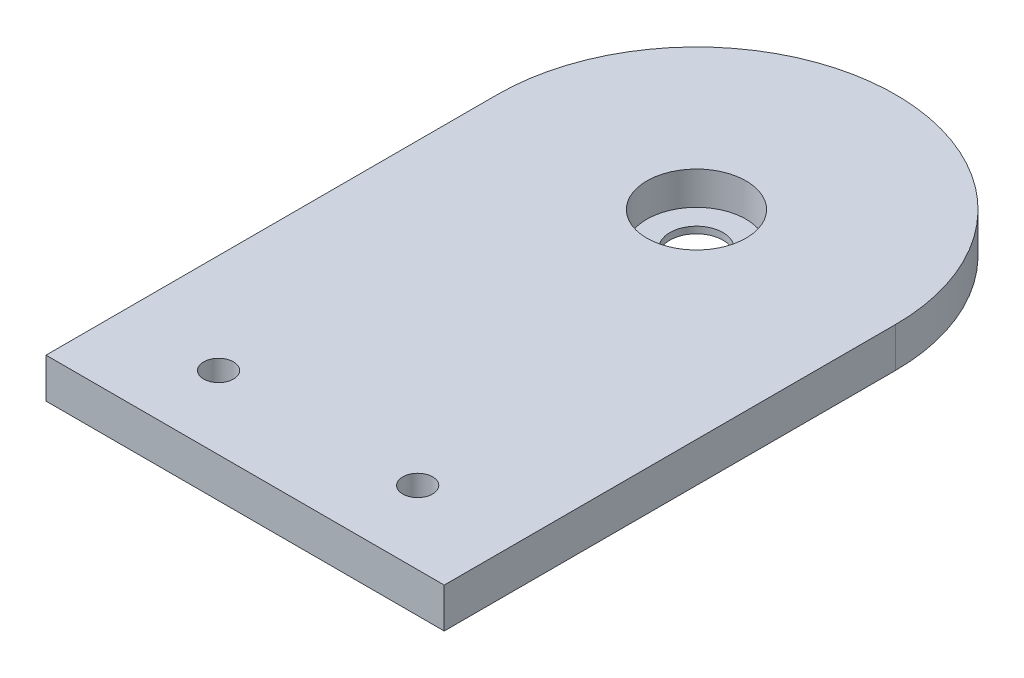
ISO-10303-21;
HEADER;
FILE_DESCRIPTION(('STEP AP214'),'2;1');
FILE_NAME('part.step','',(''),(''),'','','');
FILE_SCHEMA(('AUTOMOTIVE_DESIGN { 1 0 10303 214 1 1 1 1 }'));
ENDSEC;
DATA;
#1=APPLICATION_CONTEXT('core data for automotive mechanical design processes');
#2=APPLICATION_PROTOCOL_DEFINITION('international standard','automotive_design',2000,#1);
#3=PRODUCT_CONTEXT('',#1,'mechanical');
#4=PRODUCT('Part','Part','',(#3));
#5=PRODUCT_RELATED_PRODUCT_CATEGORY('part','',(#4));
#6=PRODUCT_DEFINITION_FORMATION('','',#4);
#7=PRODUCT_DEFINITION_CONTEXT('part definition',#1,'design');
#8=PRODUCT_DEFINITION('design','',#6,#7);
#9=PRODUCT_DEFINITION_SHAPE('','',#8);
#10=(LENGTH_UNIT() NAMED_UNIT(*) SI_UNIT(.MILLI.,.METRE.));
#11=(NAMED_UNIT(*) PLANE_ANGLE_UNIT() SI_UNIT($,.RADIAN.));
#12=(NAMED_UNIT(*) SI_UNIT($,.STERADIAN.) SOLID_ANGLE_UNIT());
#13=UNCERTAINTY_MEASURE_WITH_UNIT(LENGTH_MEASURE(1.E-05),#10,'distance_accuracy_value','');
#14=(GEOMETRIC_REPRESENTATION_CONTEXT(3) GLOBAL_UNCERTAINTY_ASSIGNED_CONTEXT((#13)) GLOBAL_UNIT_ASSIGNED_CONTEXT((#10,
#11,#12)) REPRESENTATION_CONTEXT('',''));
#15=CARTESIAN_POINT('',(0.,0.,0.));
#16=DIRECTION('',(0.,0.,1.));
#17=DIRECTION('',(1.,0.,0.));
#18=AXIS2_PLACEMENT_3D('',#15,#16,#17);
#19=CARTESIAN_POINT('',(30.,-59.75,379.));
#20=DIRECTION('',(-1.,0.,0.));
#21=DIRECTION('',(0.,0.,1.));
#22=AXIS2_PLACEMENT_3D('',#19,#20,#21);
#23=PLANE('',#22);
#24=DIRECTION('',(0.,0.,-1.));
#25=VECTOR('',#24,1.);
#26=CARTESIAN_POINT('',(30.,-65.75,379.));
#27=LINE('',#26,#25);
#28=CARTESIAN_POINT('',(30.,-65.75,398.));
#29=VERTEX_POINT('',#28);
#30=CARTESIAN_POINT('',(30.,-65.75,330.));
#31=VERTEX_POINT('',#30);
#32=EDGE_CURVE('E140',#29,#31,#27,.T.);
#33=ORIENTED_EDGE('',*,*,#32,.T.);
#34=DIRECTION('',(0.,-1.,0.));
#35=VECTOR('',#34,1.);
#36=CARTESIAN_POINT('',(30.,-59.75,330.));
#37=LINE('',#36,#35);
#38=CARTESIAN_POINT('',(30.,-59.75,330.));
#39=VERTEX_POINT('',#38);
#40=EDGE_CURVE('E11',#39,#31,#37,.T.);
#41=ORIENTED_EDGE('',*,*,#40,.F.);
#42=DIRECTION('',(0.,0.,-1.));
#43=VECTOR('',#42,1.);
#44=CARTESIAN_POINT('',(30.,-59.75,379.));
#45=LINE('',#44,#43);
#46=CARTESIAN_POINT('',(30.,-59.75,398.));
#47=VERTEX_POINT('',#46);
#48=EDGE_CURVE('E91',#47,#39,#45,.T.);
#49=ORIENTED_EDGE('',*,*,#48,.F.);
#50=DIRECTION('',(0.,-1.,0.));
#51=VECTOR('',#50,1.);
#52=CARTESIAN_POINT('',(30.,-59.75,398.));
#53=LINE('',#52,#51);
#54=EDGE_CURVE('E101',#47,#29,#53,.T.);
#55=ORIENTED_EDGE('',*,*,#54,.T.);
#56=EDGE_LOOP('',(#33,#41,#49,#55));
#57=FACE_BOUND('',#56,.T.);
#58=ADVANCED_FACE('F43',(#57),#23,.F.);
#59=CARTESIAN_POINT('',(-30.,-59.75,379.));
#60=DIRECTION('',(1.,0.,0.));
#61=DIRECTION('',(0.,0.,-1.));
#62=AXIS2_PLACEMENT_3D('',#59,#60,#61);
#63=PLANE('',#62);
#64=DIRECTION('',(0.,0.,1.));
#65=VECTOR('',#64,1.);
#66=CARTESIAN_POINT('',(-30.,-65.75,379.));
#67=LINE('',#66,#65);
#68=CARTESIAN_POINT('',(-30.,-65.75,330.));
#69=VERTEX_POINT('',#68);
#70=CARTESIAN_POINT('',(-30.,-65.75,398.));
#71=VERTEX_POINT('',#70);
#72=EDGE_CURVE('E97',#69,#71,#67,.T.);
#73=ORIENTED_EDGE('',*,*,#72,.T.);
#74=DIRECTION('',(0.,-1.,0.));
#75=VECTOR('',#74,1.);
#76=CARTESIAN_POINT('',(-30.,-59.75,398.));
#77=LINE('',#76,#75);
#78=CARTESIAN_POINT('',(-30.,-59.75,398.));
#79=VERTEX_POINT('',#78);
#80=EDGE_CURVE('E92',#79,#71,#77,.T.);
#81=ORIENTED_EDGE('',*,*,#80,.F.);
#82=DIRECTION('',(0.,0.,1.));
#83=VECTOR('',#82,1.);
#84=CARTESIAN_POINT('',(-30.,-59.75,379.));
#85=LINE('',#84,#83);
#86=CARTESIAN_POINT('',(-30.,-59.75,330.));
#87=VERTEX_POINT('',#86);
#88=EDGE_CURVE('E82',#87,#79,#85,.T.);
#89=ORIENTED_EDGE('',*,*,#88,.F.);
#90=DIRECTION('',(0.,-1.,0.));
#91=VECTOR('',#90,1.);
#92=CARTESIAN_POINT('',(-30.,-59.75,330.));
#93=LINE('',#92,#91);
#94=EDGE_CURVE('E51',#87,#69,#93,.T.);
#95=ORIENTED_EDGE('',*,*,#94,.T.);
#96=EDGE_LOOP('',(#73,#81,#89,#95));
#97=FACE_BOUND('',#96,.T.);
#98=ADVANCED_FACE('F94',(#97),#63,.F.);
#99=CARTESIAN_POINT('',(0.,-59.75,0.));
#100=DIRECTION('',(0.,-1.,0.));
#101=DIRECTION('',(0.,0.,-1.));
#102=AXIS2_PLACEMENT_3D('',#99,#100,#101);
#103=PLANE('',#102);
#104=CARTESIAN_POINT('',(-15.,-59.75,387.));
#105=DIRECTION('',(0.,1.,0.));
#106=DIRECTION('',(0.,0.,1.));
#107=AXIS2_PLACEMENT_3D('',#104,#105,#106);
#108=CIRCLE('',#107,2.25);
#109=CARTESIAN_POINT('',(-15.,-59.75,389.25));
#110=VERTEX_POINT('',#109);
#111=EDGE_CURVE('E112',#110,#110,#108,.T.);
#112=ORIENTED_EDGE('',*,*,#111,.F.);
#113=EDGE_LOOP('',(#112));
#114=FACE_BOUND('',#113,.T.);
#115=CARTESIAN_POINT('',(15.,-59.75,387.));
#116=DIRECTION('',(0.,1.,0.));
#117=DIRECTION('',(0.,0.,1.));
#118=AXIS2_PLACEMENT_3D('',#115,#116,#117);
#119=CIRCLE('',#118,2.25);
#120=CARTESIAN_POINT('',(15.,-59.75,389.25));
#121=VERTEX_POINT('',#120);
#122=EDGE_CURVE('E120',#121,#121,#119,.T.);
#123=ORIENTED_EDGE('',*,*,#122,.F.);
#124=EDGE_LOOP('',(#123));
#125=FACE_BOUND('',#124,.T.);
#126=CARTESIAN_POINT('',(0.,-59.75,330.));
#127=DIRECTION('',(0.,1.,0.));
#128=DIRECTION('',(0.,0.,1.));
#129=AXIS2_PLACEMENT_3D('',#126,#127,#128);
#130=CIRCLE('',#129,7.475);
#131=CARTESIAN_POINT('',(0.,-59.75,337.475));
#132=VERTEX_POINT('',#131);
#133=EDGE_CURVE('E129',#132,#132,#130,.T.);
#134=ORIENTED_EDGE('',*,*,#133,.F.);
#135=EDGE_LOOP('',(#134));
#136=FACE_BOUND('',#135,.T.);
#137=ORIENTED_EDGE('',*,*,#48,.T.);
#138=CARTESIAN_POINT('',(0.,-59.75,330.));
#139=DIRECTION('',(0.,1.,0.));
#140=DIRECTION('',(0.,0.,1.));
#141=AXIS2_PLACEMENT_3D('',#138,#139,#140);
#142=CIRCLE('',#141,30.);
#143=EDGE_CURVE('E88',#39,#87,#142,.T.);
#144=ORIENTED_EDGE('',*,*,#143,.T.);
#145=ORIENTED_EDGE('',*,*,#88,.T.);
#146=DIRECTION('',(1.,0.,0.));
#147=VECTOR('',#146,1.);
#148=CARTESIAN_POINT('',(-30.,-59.75,398.));
#149=LINE('',#148,#147);
#150=EDGE_CURVE('E86',#79,#47,#149,.T.);
#151=ORIENTED_EDGE('',*,*,#150,.T.);
#152=EDGE_LOOP('',(#137,#144,#145,#151));
#153=FACE_BOUND('',#152,.T.);
#154=ADVANCED_FACE('F81',(#114,#125,#136,#153),#103,.F.);
#155=CARTESIAN_POINT('',(0.,-65.75,0.));
#156=DIRECTION('',(0.,-1.,0.));
#157=DIRECTION('',(0.,0.,-1.));
#158=AXIS2_PLACEMENT_3D('',#155,#156,#157);
#159=PLANE('',#158);
#160=CARTESIAN_POINT('',(-15.,-65.75,387.));
#161=DIRECTION('',(0.,1.,0.));
#162=DIRECTION('',(0.,0.,1.));
#163=AXIS2_PLACEMENT_3D('',#160,#161,#162);
#164=CIRCLE('',#163,2.25);
#165=CARTESIAN_POINT('',(-15.,-65.75,389.25));
#166=VERTEX_POINT('',#165);
#167=EDGE_CURVE('E192',#166,#166,#164,.T.);
#168=ORIENTED_EDGE('',*,*,#167,.T.);
#169=EDGE_LOOP('',(#168));
#170=FACE_BOUND('',#169,.T.);
#171=CARTESIAN_POINT('',(15.,-65.75,387.));
#172=DIRECTION('',(0.,1.,0.));
#173=DIRECTION('',(0.,0.,1.));
#174=AXIS2_PLACEMENT_3D('',#171,#172,#173);
#175=CIRCLE('',#174,2.25);
#176=CARTESIAN_POINT('',(15.,-65.75,389.25));
#177=VERTEX_POINT('',#176);
#178=EDGE_CURVE('E195',#177,#177,#175,.T.);
#179=ORIENTED_EDGE('',*,*,#178,.T.);
#180=EDGE_LOOP('',(#179));
#181=FACE_BOUND('',#180,.T.);
#182=CARTESIAN_POINT('',(0.,-65.75,330.));
#183=DIRECTION('',(0.,1.,0.));
#184=DIRECTION('',(0.,0.,1.));
#185=AXIS2_PLACEMENT_3D('',#182,#183,#184);
#186=CIRCLE('',#185,4.);
#187=CARTESIAN_POINT('',(0.,-65.75,334.));
#188=VERTEX_POINT('',#187);
#189=EDGE_CURVE('E105',#188,#188,#186,.T.);
#190=ORIENTED_EDGE('',*,*,#189,.T.);
#191=EDGE_LOOP('',(#190));
#192=FACE_BOUND('',#191,.T.);
#193=ORIENTED_EDGE('',*,*,#72,.F.);
#194=CARTESIAN_POINT('',(0.,-65.75,330.));
#195=DIRECTION('',(0.,1.,0.));
#196=DIRECTION('',(0.,0.,1.));
#197=AXIS2_PLACEMENT_3D('',#194,#195,#196);
#198=CIRCLE('',#197,30.);
#199=EDGE_CURVE('E60',#31,#69,#198,.T.);
#200=ORIENTED_EDGE('',*,*,#199,.F.);
#201=ORIENTED_EDGE('',*,*,#32,.F.);
#202=DIRECTION('',(1.,0.,0.));
#203=VECTOR('',#202,1.);
#204=CARTESIAN_POINT('',(-30.,-65.75,398.));
#205=LINE('',#204,#203);
#206=EDGE_CURVE('E108',#71,#29,#205,.T.);
#207=ORIENTED_EDGE('',*,*,#206,.F.);
#208=EDGE_LOOP('',(#193,#200,#201,#207));
#209=FACE_BOUND('',#208,.T.);
#210=ADVANCED_FACE('F149',(#170,#181,#192,#209),#159,.T.);
#211=CARTESIAN_POINT('',(0.,-59.75,330.));
#212=DIRECTION('',(0.,-1.,0.));
#213=DIRECTION('',(0.,0.,-1.));
#214=AXIS2_PLACEMENT_3D('',#211,#212,#213);
#215=CYLINDRICAL_SURFACE('',#214,30.);
#216=ORIENTED_EDGE('',*,*,#143,.F.);
#217=ORIENTED_EDGE('',*,*,#40,.T.);
#218=ORIENTED_EDGE('',*,*,#199,.T.);
#219=ORIENTED_EDGE('',*,*,#94,.F.);
#220=EDGE_LOOP('',(#216,#217,#218,#219));
#221=FACE_BOUND('',#220,.T.);
#222=ADVANCED_FACE('F157',(#221),#215,.T.);
#223=CARTESIAN_POINT('',(0.,-59.75,330.));
#224=DIRECTION('',(0.,-1.,0.));
#225=DIRECTION('',(0.,0.,-1.));
#226=AXIS2_PLACEMENT_3D('',#223,#224,#225);
#227=CYLINDRICAL_SURFACE('',#226,7.475);
#228=ORIENTED_EDGE('',*,*,#133,.T.);
#229=EDGE_LOOP('',(#228));
#230=FACE_BOUND('',#229,.T.);
#231=CARTESIAN_POINT('',(0.,-64.75,330.));
#232=DIRECTION('',(0.,1.,0.));
#233=DIRECTION('',(0.,0.,1.));
#234=AXIS2_PLACEMENT_3D('',#231,#232,#233);
#235=CIRCLE('',#234,7.475);
#236=CARTESIAN_POINT('',(0.,-64.75,337.475));
#237=VERTEX_POINT('',#236);
#238=EDGE_CURVE('E121',#237,#237,#235,.T.);
#239=ORIENTED_EDGE('',*,*,#238,.F.);
#240=EDGE_LOOP('',(#239));
#241=FACE_BOUND('',#240,.T.);
#242=ADVANCED_FACE('F165',(#230,#241),#227,.F.);
#243=CARTESIAN_POINT('',(0.,-64.75,330.));
#244=DIRECTION('',(0.,1.,0.));
#245=DIRECTION('',(0.,0.,1.));
#246=AXIS2_PLACEMENT_3D('',#243,#244,#245);
#247=PLANE('',#246);
#248=CARTESIAN_POINT('',(0.,-64.75,330.));
#249=DIRECTION('',(0.,1.,0.));
#250=DIRECTION('',(0.,0.,1.));
#251=AXIS2_PLACEMENT_3D('',#248,#249,#250);
#252=CIRCLE('',#251,4.);
#253=CARTESIAN_POINT('',(0.,-64.75,334.));
#254=VERTEX_POINT('',#253);
#255=EDGE_CURVE('E119',#254,#254,#252,.T.);
#256=ORIENTED_EDGE('',*,*,#255,.F.);
#257=EDGE_LOOP('',(#256));
#258=FACE_BOUND('',#257,.T.);
#259=ORIENTED_EDGE('',*,*,#238,.T.);
#260=EDGE_LOOP('',(#259));
#261=FACE_BOUND('',#260,.T.);
#262=ADVANCED_FACE('F170',(#258,#261),#247,.T.);
#263=CARTESIAN_POINT('',(0.,-64.75,330.));
#264=DIRECTION('',(0.,-1.,0.));
#265=DIRECTION('',(0.,0.,-1.));
#266=AXIS2_PLACEMENT_3D('',#263,#264,#265);
#267=CYLINDRICAL_SURFACE('',#266,4.);
#268=ORIENTED_EDGE('',*,*,#255,.T.);
#269=EDGE_LOOP('',(#268));
#270=FACE_BOUND('',#269,.T.);
#271=ORIENTED_EDGE('',*,*,#189,.F.);
#272=EDGE_LOOP('',(#271));
#273=FACE_BOUND('',#272,.T.);
#274=ADVANCED_FACE('F171',(#270,#273),#267,.F.);
#275=CARTESIAN_POINT('',(-30.,-59.75,398.));
#276=DIRECTION('',(0.,0.,-1.));
#277=DIRECTION('',(-1.,0.,0.));
#278=AXIS2_PLACEMENT_3D('',#275,#276,#277);
#279=PLANE('',#278);
#280=ORIENTED_EDGE('',*,*,#206,.T.);
#281=ORIENTED_EDGE('',*,*,#54,.F.);
#282=ORIENTED_EDGE('',*,*,#150,.F.);
#283=ORIENTED_EDGE('',*,*,#80,.T.);
#284=EDGE_LOOP('',(#280,#281,#282,#283));
#285=FACE_BOUND('',#284,.T.);
#286=ADVANCED_FACE('F102',(#285),#279,.F.);
#287=CARTESIAN_POINT('',(15.,-59.75,387.));
#288=DIRECTION('',(0.,-1.,0.));
#289=DIRECTION('',(0.,0.,-1.));
#290=AXIS2_PLACEMENT_3D('',#287,#288,#289);
#291=CYLINDRICAL_SURFACE('',#290,2.25);
#292=ORIENTED_EDGE('',*,*,#122,.T.);
#293=EDGE_LOOP('',(#292));
#294=FACE_BOUND('',#293,.T.);
#295=ORIENTED_EDGE('',*,*,#178,.F.);
#296=EDGE_LOOP('',(#295));
#297=FACE_BOUND('',#296,.T.);
#298=ADVANCED_FACE('F178',(#294,#297),#291,.F.);
#299=CARTESIAN_POINT('',(-15.,-59.75,387.));
#300=DIRECTION('',(0.,-1.,0.));
#301=DIRECTION('',(0.,0.,-1.));
#302=AXIS2_PLACEMENT_3D('',#299,#300,#301);
#303=CYLINDRICAL_SURFACE('',#302,2.25);
#304=ORIENTED_EDGE('',*,*,#111,.T.);
#305=EDGE_LOOP('',(#304));
#306=FACE_BOUND('',#305,.T.);
#307=ORIENTED_EDGE('',*,*,#167,.F.);
#308=EDGE_LOOP('',(#307));
#309=FACE_BOUND('',#308,.T.);
#310=ADVANCED_FACE('F181',(#306,#309),#303,.F.);
#311=CLOSED_SHELL('',(#58,#98,#154,#210,#222,#242,#262,#274,#286,#298,#310));
#312=MANIFOLD_SOLID_BREP('B2',#311);
#313=ADVANCED_BREP_SHAPE_REPRESENTATION('',(#18,#312),#14);
#314=SHAPE_DEFINITION_REPRESENTATION(#9,#313);
ENDSEC;
END-ISO-10303-21;
